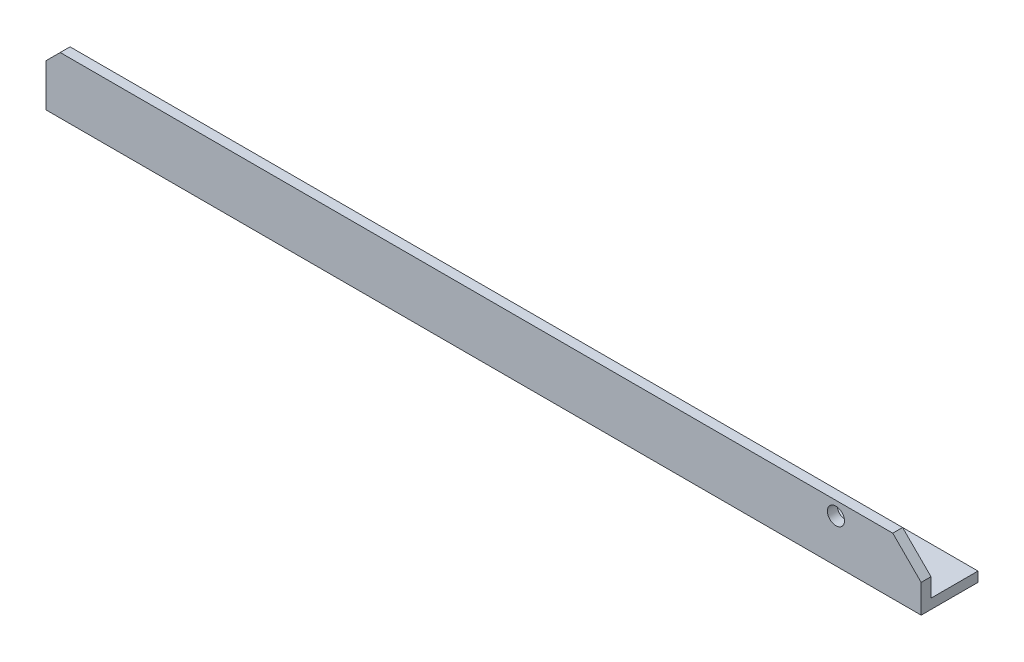
ISO-10303-21;
HEADER;
FILE_DESCRIPTION(('STEP AP214'),'2;1');
FILE_NAME('part.step','',(''),(''),'','','');
FILE_SCHEMA(('AUTOMOTIVE_DESIGN { 1 0 10303 214 1 1 1 1 }'));
ENDSEC;
DATA;
#1=APPLICATION_CONTEXT('core data for automotive mechanical design processes');
#2=APPLICATION_PROTOCOL_DEFINITION('international standard','automotive_design',2000,#1);
#3=PRODUCT_CONTEXT('',#1,'mechanical');
#4=PRODUCT('Part','Part','',(#3));
#5=PRODUCT_RELATED_PRODUCT_CATEGORY('part','',(#4));
#6=PRODUCT_DEFINITION_FORMATION('','',#4);
#7=PRODUCT_DEFINITION_CONTEXT('part definition',#1,'design');
#8=PRODUCT_DEFINITION('design','',#6,#7);
#9=PRODUCT_DEFINITION_SHAPE('','',#8);
#10=(LENGTH_UNIT() NAMED_UNIT(*) SI_UNIT(.MILLI.,.METRE.));
#11=(NAMED_UNIT(*) PLANE_ANGLE_UNIT() SI_UNIT($,.RADIAN.));
#12=(NAMED_UNIT(*) SI_UNIT($,.STERADIAN.) SOLID_ANGLE_UNIT());
#13=UNCERTAINTY_MEASURE_WITH_UNIT(LENGTH_MEASURE(1.E-05),#10,'distance_accuracy_value','');
#14=(GEOMETRIC_REPRESENTATION_CONTEXT(3) GLOBAL_UNCERTAINTY_ASSIGNED_CONTEXT((#13)) GLOBAL_UNIT_ASSIGNED_CONTEXT((#10,
#11,#12)) REPRESENTATION_CONTEXT('',''));
#15=CARTESIAN_POINT('',(0.,0.,0.));
#16=DIRECTION('',(0.,0.,1.));
#17=DIRECTION('',(1.,0.,0.));
#18=AXIS2_PLACEMENT_3D('',#15,#16,#17);
#19=CARTESIAN_POINT('',(308.,20.,0.));
#20=DIRECTION('',(0.,0.,-1.));
#21=DIRECTION('',(0.,1.,0.));
#22=AXIS2_PLACEMENT_3D('',#19,#20,#21);
#23=PLANE('',#22);
#24=CARTESIAN_POINT('',(278.,15.25,0.));
#25=DIRECTION('',(0.,0.,1.));
#26=DIRECTION('',(1.,0.,0.));
#27=AXIS2_PLACEMENT_3D('',#24,#25,#26);
#28=CIRCLE('',#27,2.99999999999999);
#29=CARTESIAN_POINT('',(281.,15.25,0.));
#30=VERTEX_POINT('',#29);
#31=EDGE_CURVE('E116',#30,#30,#28,.T.);
#32=ORIENTED_EDGE('',*,*,#31,.F.);
#33=EDGE_LOOP('',(#32));
#34=FACE_BOUND('',#33,.T.);
#35=DIRECTION('',(-1.,0.,0.));
#36=VECTOR('',#35,1.);
#37=CARTESIAN_POINT('',(308.,20.,0.));
#38=LINE('',#37,#36);
#39=CARTESIAN_POINT('',(298.,20.,0.));
#40=VERTEX_POINT('',#39);
#41=CARTESIAN_POINT('',(5.,20.,0.));
#42=VERTEX_POINT('',#41);
#43=EDGE_CURVE('E113',#40,#42,#38,.T.);
#44=ORIENTED_EDGE('',*,*,#43,.T.);
#45=DIRECTION('',(0.707106781186547,0.707106781186548,0.));
#46=VECTOR('',#45,1.);
#47=CARTESIAN_POINT('',(0.,15.,0.));
#48=LINE('',#47,#46);
#49=CARTESIAN_POINT('',(0.,15.,0.));
#50=VERTEX_POINT('',#49);
#51=EDGE_CURVE('E107',#50,#42,#48,.T.);
#52=ORIENTED_EDGE('',*,*,#51,.F.);
#53=DIRECTION('',(0.,-1.,0.));
#54=VECTOR('',#53,1.);
#55=CARTESIAN_POINT('',(0.,20.,0.));
#56=LINE('',#55,#54);
#57=CARTESIAN_POINT('',(0.,0.,0.));
#58=VERTEX_POINT('',#57);
#59=EDGE_CURVE('E151',#50,#58,#56,.T.);
#60=ORIENTED_EDGE('',*,*,#59,.T.);
#61=DIRECTION('',(-1.,0.,0.));
#62=VECTOR('',#61,1.);
#63=CARTESIAN_POINT('',(308.,0.,0.));
#64=LINE('',#63,#62);
#65=CARTESIAN_POINT('',(308.,0.,0.));
#66=VERTEX_POINT('',#65);
#67=EDGE_CURVE('E141',#66,#58,#64,.T.);
#68=ORIENTED_EDGE('',*,*,#67,.F.);
#69=DIRECTION('',(0.,-1.,0.));
#70=VECTOR('',#69,1.);
#71=CARTESIAN_POINT('',(308.,20.,0.));
#72=LINE('',#71,#70);
#73=CARTESIAN_POINT('',(308.,10.,0.));
#74=VERTEX_POINT('',#73);
#75=EDGE_CURVE('E115',#74,#66,#72,.T.);
#76=ORIENTED_EDGE('',*,*,#75,.F.);
#77=DIRECTION('',(0.707106781186548,-0.707106781186547,0.));
#78=VECTOR('',#77,1.);
#79=CARTESIAN_POINT('',(308.,10.,0.));
#80=LINE('',#79,#78);
#81=EDGE_CURVE('E51',#40,#74,#80,.T.);
#82=ORIENTED_EDGE('',*,*,#81,.F.);
#83=EDGE_LOOP('',(#44,#52,#60,#68,#76,#82));
#84=FACE_BOUND('',#83,.T.);
#85=ADVANCED_FACE('F37',(#34,#84),#23,.F.);
#86=CARTESIAN_POINT('',(308.,0.,0.));
#87=DIRECTION('',(0.,1.,0.));
#88=DIRECTION('',(0.,0.,1.));
#89=AXIS2_PLACEMENT_3D('',#86,#87,#88);
#90=PLANE('',#89);
#91=DIRECTION('',(0.,0.,-1.));
#92=VECTOR('',#91,1.);
#93=CARTESIAN_POINT('',(0.,0.,0.));
#94=LINE('',#93,#92);
#95=CARTESIAN_POINT('',(0.,0.,-20.));
#96=VERTEX_POINT('',#95);
#97=EDGE_CURVE('E161',#58,#96,#94,.T.);
#98=ORIENTED_EDGE('',*,*,#97,.T.);
#99=DIRECTION('',(-1.,0.,0.));
#100=VECTOR('',#99,1.);
#101=CARTESIAN_POINT('',(308.,0.,-20.));
#102=LINE('',#101,#100);
#103=CARTESIAN_POINT('',(308.,0.,-20.));
#104=VERTEX_POINT('',#103);
#105=EDGE_CURVE('E138',#104,#96,#102,.T.);
#106=ORIENTED_EDGE('',*,*,#105,.F.);
#107=DIRECTION('',(0.,0.,-1.));
#108=VECTOR('',#107,1.);
#109=CARTESIAN_POINT('',(308.,0.,0.));
#110=LINE('',#109,#108);
#111=EDGE_CURVE('E157',#66,#104,#110,.T.);
#112=ORIENTED_EDGE('',*,*,#111,.F.);
#113=ORIENTED_EDGE('',*,*,#67,.T.);
#114=EDGE_LOOP('',(#98,#106,#112,#113));
#115=FACE_BOUND('',#114,.T.);
#116=ADVANCED_FACE('F180',(#115),#90,.F.);
#117=CARTESIAN_POINT('',(308.,0.,-20.));
#118=DIRECTION('',(0.,0.,1.));
#119=DIRECTION('',(1.,0.,0.));
#120=AXIS2_PLACEMENT_3D('',#117,#118,#119);
#121=PLANE('',#120);
#122=DIRECTION('',(0.,1.,0.));
#123=VECTOR('',#122,1.);
#124=CARTESIAN_POINT('',(0.,0.,-20.));
#125=LINE('',#124,#123);
#126=CARTESIAN_POINT('',(0.,3.46117846701572,-20.));
#127=VERTEX_POINT('',#126);
#128=EDGE_CURVE('E159',#96,#127,#125,.T.);
#129=ORIENTED_EDGE('',*,*,#128,.T.);
#130=DIRECTION('',(-1.,0.,0.));
#131=VECTOR('',#130,1.);
#132=CARTESIAN_POINT('',(308.,3.46117846701572,-20.));
#133=LINE('',#132,#131);
#134=CARTESIAN_POINT('',(308.,3.46117846701572,-20.));
#135=VERTEX_POINT('',#134);
#136=EDGE_CURVE('E135',#135,#127,#133,.T.);
#137=ORIENTED_EDGE('',*,*,#136,.F.);
#138=DIRECTION('',(0.,1.,0.));
#139=VECTOR('',#138,1.);
#140=CARTESIAN_POINT('',(308.,0.,-20.));
#141=LINE('',#140,#139);
#142=EDGE_CURVE('E167',#104,#135,#141,.T.);
#143=ORIENTED_EDGE('',*,*,#142,.F.);
#144=ORIENTED_EDGE('',*,*,#105,.T.);
#145=EDGE_LOOP('',(#129,#137,#143,#144));
#146=FACE_BOUND('',#145,.T.);
#147=ADVANCED_FACE('F188',(#146),#121,.F.);
#148=CARTESIAN_POINT('',(308.,3.46117846701572,-20.));
#149=DIRECTION('',(0.,-1.,0.));
#150=DIRECTION('',(0.,0.,-1.));
#151=AXIS2_PLACEMENT_3D('',#148,#149,#150);
#152=PLANE('',#151);
#153=DIRECTION('',(0.,0.,1.));
#154=VECTOR('',#153,1.);
#155=CARTESIAN_POINT('',(0.,3.46117846701572,-20.));
#156=LINE('',#155,#154);
#157=CARTESIAN_POINT('',(0.,3.46117846701572,-3.46117846701572));
#158=VERTEX_POINT('',#157);
#159=EDGE_CURVE('E156',#127,#158,#156,.T.);
#160=ORIENTED_EDGE('',*,*,#159,.T.);
#161=DIRECTION('',(-1.,0.,0.));
#162=VECTOR('',#161,1.);
#163=CARTESIAN_POINT('',(308.,3.46117846701572,-3.46117846701572));
#164=LINE('',#163,#162);
#165=CARTESIAN_POINT('',(308.,3.46117846701572,-3.46117846701572));
#166=VERTEX_POINT('',#165);
#167=EDGE_CURVE('E124',#166,#158,#164,.T.);
#168=ORIENTED_EDGE('',*,*,#167,.F.);
#169=DIRECTION('',(0.,0.,1.));
#170=VECTOR('',#169,1.);
#171=CARTESIAN_POINT('',(308.,3.46117846701572,-20.));
#172=LINE('',#171,#170);
#173=EDGE_CURVE('E127',#135,#166,#172,.T.);
#174=ORIENTED_EDGE('',*,*,#173,.F.);
#175=ORIENTED_EDGE('',*,*,#136,.T.);
#176=EDGE_LOOP('',(#160,#168,#174,#175));
#177=FACE_BOUND('',#176,.T.);
#178=ADVANCED_FACE('F186',(#177),#152,.F.);
#179=CARTESIAN_POINT('',(308.,3.46117846701572,-3.46117846701572));
#180=DIRECTION('',(0.,0.,1.));
#181=DIRECTION('',(1.,0.,0.));
#182=AXIS2_PLACEMENT_3D('',#179,#180,#181);
#183=PLANE('',#182);
#184=CARTESIAN_POINT('',(278.,15.25,-3.46117846701572));
#185=DIRECTION('',(0.,0.,1.));
#186=DIRECTION('',(1.,0.,0.));
#187=AXIS2_PLACEMENT_3D('',#184,#185,#186);
#188=CIRCLE('',#187,2.99999999999999);
#189=CARTESIAN_POINT('',(281.,15.25,-3.46117846701572));
#190=VERTEX_POINT('',#189);
#191=EDGE_CURVE('E40',#190,#190,#188,.T.);
#192=ORIENTED_EDGE('',*,*,#191,.T.);
#193=EDGE_LOOP('',(#192));
#194=FACE_BOUND('',#193,.T.);
#195=DIRECTION('',(0.,1.,0.));
#196=VECTOR('',#195,1.);
#197=CARTESIAN_POINT('',(0.,3.46117846701572,-3.46117846701572));
#198=LINE('',#197,#196);
#199=CARTESIAN_POINT('',(0.,15.,-3.46117846701572));
#200=VERTEX_POINT('',#199);
#201=EDGE_CURVE('E130',#158,#200,#198,.T.);
#202=ORIENTED_EDGE('',*,*,#201,.T.);
#203=DIRECTION('',(0.707106781186547,0.707106781186548,0.));
#204=VECTOR('',#203,1.);
#205=CARTESIAN_POINT('',(148.230589233508,163.230589233508,-3.46117846701572));
#206=LINE('',#205,#204);
#207=CARTESIAN_POINT('',(5.,20.,-3.46117846701572));
#208=VERTEX_POINT('',#207);
#209=EDGE_CURVE('E59',#200,#208,#206,.T.);
#210=ORIENTED_EDGE('',*,*,#209,.T.);
#211=DIRECTION('',(-1.,0.,0.));
#212=VECTOR('',#211,1.);
#213=CARTESIAN_POINT('',(308.,20.,-3.46117846701572));
#214=LINE('',#213,#212);
#215=CARTESIAN_POINT('',(298.,20.,-3.46117846701572));
#216=VERTEX_POINT('',#215);
#217=EDGE_CURVE('E121',#216,#208,#214,.T.);
#218=ORIENTED_EDGE('',*,*,#217,.F.);
#219=DIRECTION('',(0.707106781186548,-0.707106781186547,0.));
#220=VECTOR('',#219,1.);
#221=CARTESIAN_POINT('',(311.269410766492,6.73058923350786,-3.46117846701572));
#222=LINE('',#221,#220);
#223=CARTESIAN_POINT('',(308.,10.,-3.46117846701572));
#224=VERTEX_POINT('',#223);
#225=EDGE_CURVE('E102',#216,#224,#222,.T.);
#226=ORIENTED_EDGE('',*,*,#225,.T.);
#227=DIRECTION('',(0.,1.,0.));
#228=VECTOR('',#227,1.);
#229=CARTESIAN_POINT('',(308.,3.46117846701572,-3.46117846701572));
#230=LINE('',#229,#228);
#231=EDGE_CURVE('E122',#166,#224,#230,.T.);
#232=ORIENTED_EDGE('',*,*,#231,.F.);
#233=ORIENTED_EDGE('',*,*,#167,.T.);
#234=EDGE_LOOP('',(#202,#210,#218,#226,#232,#233));
#235=FACE_BOUND('',#234,.T.);
#236=ADVANCED_FACE('F153',(#194,#235),#183,.F.);
#237=CARTESIAN_POINT('',(308.,20.,-3.46117846701572));
#238=DIRECTION('',(0.,-1.,0.));
#239=DIRECTION('',(0.,0.,-1.));
#240=AXIS2_PLACEMENT_3D('',#237,#238,#239);
#241=PLANE('',#240);
#242=ORIENTED_EDGE('',*,*,#217,.T.);
#243=DIRECTION('',(0.,0.,1.));
#244=VECTOR('',#243,1.);
#245=CARTESIAN_POINT('',(5.,20.,-20.));
#246=LINE('',#245,#244);
#247=EDGE_CURVE('E120',#208,#42,#246,.T.);
#248=ORIENTED_EDGE('',*,*,#247,.T.);
#249=ORIENTED_EDGE('',*,*,#43,.F.);
#250=DIRECTION('',(0.,0.,1.));
#251=VECTOR('',#250,1.);
#252=CARTESIAN_POINT('',(298.,20.,-20.));
#253=LINE('',#252,#251);
#254=EDGE_CURVE('E99',#216,#40,#253,.T.);
#255=ORIENTED_EDGE('',*,*,#254,.F.);
#256=EDGE_LOOP('',(#242,#248,#249,#255));
#257=FACE_BOUND('',#256,.T.);
#258=ADVANCED_FACE('F119',(#257),#241,.F.);
#259=CARTESIAN_POINT('',(308.,0.,0.));
#260=DIRECTION('',(1.,0.,0.));
#261=DIRECTION('',(0.,0.,-1.));
#262=AXIS2_PLACEMENT_3D('',#259,#260,#261);
#263=PLANE('',#262);
#264=DIRECTION('',(0.,0.,-1.));
#265=VECTOR('',#264,1.);
#266=CARTESIAN_POINT('',(308.,10.,0.));
#267=LINE('',#266,#265);
#268=EDGE_CURVE('E11',#74,#224,#267,.T.);
#269=ORIENTED_EDGE('',*,*,#268,.F.);
#270=ORIENTED_EDGE('',*,*,#75,.T.);
#271=ORIENTED_EDGE('',*,*,#111,.T.);
#272=ORIENTED_EDGE('',*,*,#142,.T.);
#273=ORIENTED_EDGE('',*,*,#173,.T.);
#274=ORIENTED_EDGE('',*,*,#231,.T.);
#275=EDGE_LOOP('',(#269,#270,#271,#272,#273,#274));
#276=FACE_BOUND('',#275,.T.);
#277=ADVANCED_FACE('F183',(#276),#263,.T.);
#278=CARTESIAN_POINT('',(0.,0.,0.));
#279=DIRECTION('',(1.,0.,0.));
#280=DIRECTION('',(0.,0.,-1.));
#281=AXIS2_PLACEMENT_3D('',#278,#279,#280);
#282=PLANE('',#281);
#283=ORIENTED_EDGE('',*,*,#59,.F.);
#284=DIRECTION('',(0.,0.,-1.));
#285=VECTOR('',#284,1.);
#286=CARTESIAN_POINT('',(0.,15.,0.));
#287=LINE('',#286,#285);
#288=EDGE_CURVE('E45',#50,#200,#287,.T.);
#289=ORIENTED_EDGE('',*,*,#288,.T.);
#290=ORIENTED_EDGE('',*,*,#201,.F.);
#291=ORIENTED_EDGE('',*,*,#159,.F.);
#292=ORIENTED_EDGE('',*,*,#128,.F.);
#293=ORIENTED_EDGE('',*,*,#97,.F.);
#294=EDGE_LOOP('',(#283,#289,#290,#291,#292,#293));
#295=FACE_BOUND('',#294,.T.);
#296=ADVANCED_FACE('F148',(#295),#282,.F.);
#297=CARTESIAN_POINT('',(0.,15.,-20.));
#298=DIRECTION('',(0.707106781186548,-0.707106781186547,0.));
#299=DIRECTION('',(0.707106781186547,0.707106781186548,0.));
#300=AXIS2_PLACEMENT_3D('',#297,#298,#299);
#301=PLANE('',#300);
#302=ORIENTED_EDGE('',*,*,#288,.F.);
#303=ORIENTED_EDGE('',*,*,#51,.T.);
#304=ORIENTED_EDGE('',*,*,#247,.F.);
#305=ORIENTED_EDGE('',*,*,#209,.F.);
#306=EDGE_LOOP('',(#302,#303,#304,#305));
#307=FACE_BOUND('',#306,.T.);
#308=ADVANCED_FACE('F175',(#307),#301,.F.);
#309=CARTESIAN_POINT('',(308.,10.,-20.));
#310=DIRECTION('',(-0.707106781186547,-0.707106781186548,0.));
#311=DIRECTION('',(0.707106781186548,-0.707106781186547,0.));
#312=AXIS2_PLACEMENT_3D('',#309,#310,#311);
#313=PLANE('',#312);
#314=ORIENTED_EDGE('',*,*,#254,.T.);
#315=ORIENTED_EDGE('',*,*,#81,.T.);
#316=ORIENTED_EDGE('',*,*,#268,.T.);
#317=ORIENTED_EDGE('',*,*,#225,.F.);
#318=EDGE_LOOP('',(#314,#315,#316,#317));
#319=FACE_BOUND('',#318,.T.);
#320=ADVANCED_FACE('F100',(#319),#313,.F.);
#321=CARTESIAN_POINT('',(278.,15.25,-20.));
#322=DIRECTION('',(0.,0.,1.));
#323=DIRECTION('',(1.,0.,0.));
#324=AXIS2_PLACEMENT_3D('',#321,#322,#323);
#325=CYLINDRICAL_SURFACE('',#324,2.99999999999999);
#326=ORIENTED_EDGE('',*,*,#31,.T.);
#327=EDGE_LOOP('',(#326));
#328=FACE_BOUND('',#327,.T.);
#329=ORIENTED_EDGE('',*,*,#191,.F.);
#330=EDGE_LOOP('',(#329));
#331=FACE_BOUND('',#330,.T.);
#332=ADVANCED_FACE('F205',(#328,#331),#325,.F.);
#333=CLOSED_SHELL('',(#85,#116,#147,#178,#236,#258,#277,#296,#308,#320,#332));
#334=MANIFOLD_SOLID_BREP('B2',#333);
#335=ADVANCED_BREP_SHAPE_REPRESENTATION('',(#18,#334),#14);
#336=SHAPE_DEFINITION_REPRESENTATION(#9,#335);
ENDSEC;
END-ISO-10303-21;
